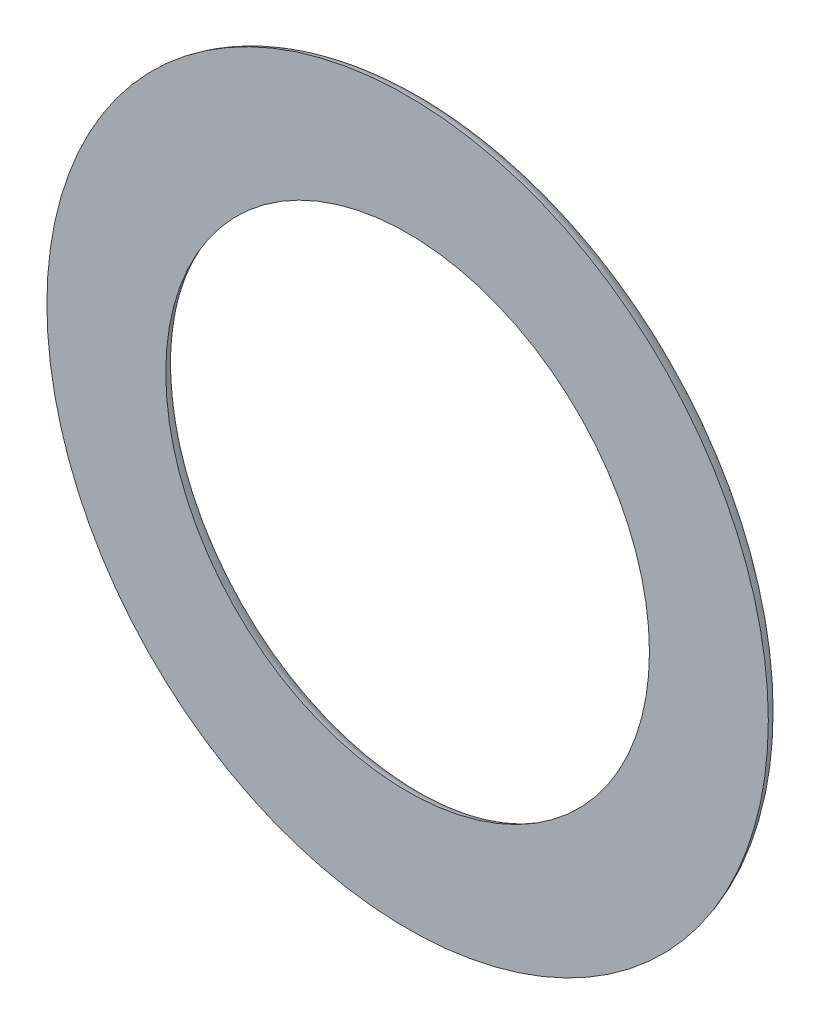
ISO-10303-21;
HEADER;
FILE_DESCRIPTION(('STEP AP214'),'2;1');
FILE_NAME('part.step','',(''),(''),'','','');
FILE_SCHEMA(('AUTOMOTIVE_DESIGN { 1 0 10303 214 1 1 1 1 }'));
ENDSEC;
DATA;
#1=APPLICATION_CONTEXT('core data for automotive mechanical design processes');
#2=APPLICATION_PROTOCOL_DEFINITION('international standard','automotive_design',2000,#1);
#3=PRODUCT_CONTEXT('',#1,'mechanical');
#4=PRODUCT('Part','Part','',(#3));
#5=PRODUCT_RELATED_PRODUCT_CATEGORY('part','',(#4));
#6=PRODUCT_DEFINITION_FORMATION('','',#4);
#7=PRODUCT_DEFINITION_CONTEXT('part definition',#1,'design');
#8=PRODUCT_DEFINITION('design','',#6,#7);
#9=PRODUCT_DEFINITION_SHAPE('','',#8);
#10=(LENGTH_UNIT() NAMED_UNIT(*) SI_UNIT(.MILLI.,.METRE.));
#11=(NAMED_UNIT(*) PLANE_ANGLE_UNIT() SI_UNIT($,.RADIAN.));
#12=(NAMED_UNIT(*) SI_UNIT($,.STERADIAN.) SOLID_ANGLE_UNIT());
#13=UNCERTAINTY_MEASURE_WITH_UNIT(LENGTH_MEASURE(1.E-05),#10,'distance_accuracy_value','');
#14=(GEOMETRIC_REPRESENTATION_CONTEXT(3) GLOBAL_UNCERTAINTY_ASSIGNED_CONTEXT((#13)) GLOBAL_UNIT_ASSIGNED_CONTEXT((#10,
#11,#12)) REPRESENTATION_CONTEXT('',''));
#15=CARTESIAN_POINT('',(0.,0.,0.));
#16=DIRECTION('',(0.,0.,1.));
#17=DIRECTION('',(1.,0.,0.));
#18=AXIS2_PLACEMENT_3D('',#15,#16,#17);
#19=CARTESIAN_POINT('',(0.,0.,3.7));
#20=DIRECTION('',(0.,0.,-1.));
#21=DIRECTION('',(0.,-1.,0.));
#22=AXIS2_PLACEMENT_3D('',#19,#20,#21);
#23=PLANE('',#22);
#24=CARTESIAN_POINT('',(0.,0.,3.7));
#25=DIRECTION('',(0.,0.,1.));
#26=DIRECTION('',(1.,0.,0.));
#27=AXIS2_PLACEMENT_3D('',#24,#25,#26);
#28=CIRCLE('',#27,2.95);
#29=CARTESIAN_POINT('',(2.95,0.,3.7));
#30=VERTEX_POINT('',#29);
#31=EDGE_CURVE('E54',#30,#30,#28,.T.);
#32=ORIENTED_EDGE('',*,*,#31,.F.);
#33=EDGE_LOOP('',(#32));
#34=FACE_BOUND('',#33,.T.);
#35=CARTESIAN_POINT('',(0.,0.,3.7));
#36=DIRECTION('',(0.,0.,1.));
#37=DIRECTION('',(1.,0.,0.));
#38=AXIS2_PLACEMENT_3D('',#35,#36,#37);
#39=CIRCLE('',#38,4.4);
#40=CARTESIAN_POINT('',(4.4,0.,3.7));
#41=VERTEX_POINT('',#40);
#42=EDGE_CURVE('E11',#41,#41,#39,.T.);
#43=ORIENTED_EDGE('',*,*,#42,.T.);
#44=EDGE_LOOP('',(#43));
#45=FACE_BOUND('',#44,.T.);
#46=ADVANCED_FACE('F17',(#34,#45),#23,.F.);
#47=CARTESIAN_POINT('',(0.,0.,3.75));
#48=DIRECTION('',(0.,0.,-1.));
#49=DIRECTION('',(-1.,0.,0.));
#50=AXIS2_PLACEMENT_3D('',#47,#48,#49);
#51=TOROIDAL_SURFACE('',#50,4.15505102572168,0.25);
#52=CARTESIAN_POINT('',(0.,0.,3.5));
#53=DIRECTION('',(0.,0.,1.));
#54=DIRECTION('',(-1.,0.,0.));
#55=AXIS2_PLACEMENT_3D('',#52,#53,#54);
#56=CIRCLE('',#55,4.15505102572168);
#57=CARTESIAN_POINT('',(4.15505102572168,0.,3.5));
#58=VERTEX_POINT('',#57);
#59=EDGE_CURVE('E62',#58,#58,#56,.T.);
#60=ORIENTED_EDGE('',*,*,#59,.T.);
#61=CARTESIAN_POINT('',(4.15505102572168,0.,3.75));
#62=DIRECTION('',(0.,-1.,0.));
#63=DIRECTION('',(1.,0.,0.));
#64=AXIS2_PLACEMENT_3D('',#61,#62,#63);
#65=CIRCLE('',#64,0.25);
#66=EDGE_CURVE('E27',#58,#41,#65,.T.);
#67=ORIENTED_EDGE('',*,*,#66,.T.);
#68=ORIENTED_EDGE('',*,*,#42,.F.);
#69=ORIENTED_EDGE('',*,*,#66,.F.);
#70=EDGE_LOOP('',(#60,#67,#68,#69));
#71=FACE_BOUND('',#70,.T.);
#72=ADVANCED_FACE('F19',(#71),#51,.T.);
#73=CARTESIAN_POINT('',(0.,0.,3.5));
#74=DIRECTION('',(0.,0.,-1.));
#75=DIRECTION('',(0.,-1.,0.));
#76=AXIS2_PLACEMENT_3D('',#73,#74,#75);
#77=PLANE('',#76);
#78=CARTESIAN_POINT('',(0.,0.,3.5));
#79=DIRECTION('',(0.,0.,-1.));
#80=DIRECTION('',(-1.,0.,0.));
#81=AXIS2_PLACEMENT_3D('',#78,#79,#80);
#82=CIRCLE('',#81,3.19494897427832);
#83=CARTESIAN_POINT('',(3.19494897427832,0.,3.5));
#84=VERTEX_POINT('',#83);
#85=EDGE_CURVE('E47',#84,#84,#82,.T.);
#86=ORIENTED_EDGE('',*,*,#85,.F.);
#87=EDGE_LOOP('',(#86));
#88=FACE_BOUND('',#87,.T.);
#89=ORIENTED_EDGE('',*,*,#59,.F.);
#90=EDGE_LOOP('',(#89));
#91=FACE_BOUND('',#90,.T.);
#92=ADVANCED_FACE('F75',(#88,#91),#77,.T.);
#93=CARTESIAN_POINT('',(0.,0.,3.75));
#94=DIRECTION('',(0.,0.,-1.));
#95=DIRECTION('',(-1.,0.,0.));
#96=AXIS2_PLACEMENT_3D('',#93,#94,#95);
#97=TOROIDAL_SURFACE('',#96,3.19494897427832,0.25);
#98=ORIENTED_EDGE('',*,*,#31,.T.);
#99=CARTESIAN_POINT('',(3.19494897427832,0.,3.75));
#100=DIRECTION('',(0.,-1.,0.));
#101=DIRECTION('',(1.,0.,0.));
#102=AXIS2_PLACEMENT_3D('',#99,#100,#101);
#103=CIRCLE('',#102,0.25);
#104=EDGE_CURVE('E51',#30,#84,#103,.T.);
#105=ORIENTED_EDGE('',*,*,#104,.T.);
#106=ORIENTED_EDGE('',*,*,#85,.T.);
#107=ORIENTED_EDGE('',*,*,#104,.F.);
#108=EDGE_LOOP('',(#98,#105,#106,#107));
#109=FACE_BOUND('',#108,.T.);
#110=ADVANCED_FACE('F52',(#109),#97,.T.);
#111=CLOSED_SHELL('',(#46,#72,#92,#110));
#112=MANIFOLD_SOLID_BREP('B1',#111);
#113=ADVANCED_BREP_SHAPE_REPRESENTATION('',(#18,#112),#14);
#114=SHAPE_DEFINITION_REPRESENTATION(#9,#113);
ENDSEC;
END-ISO-10303-21;
